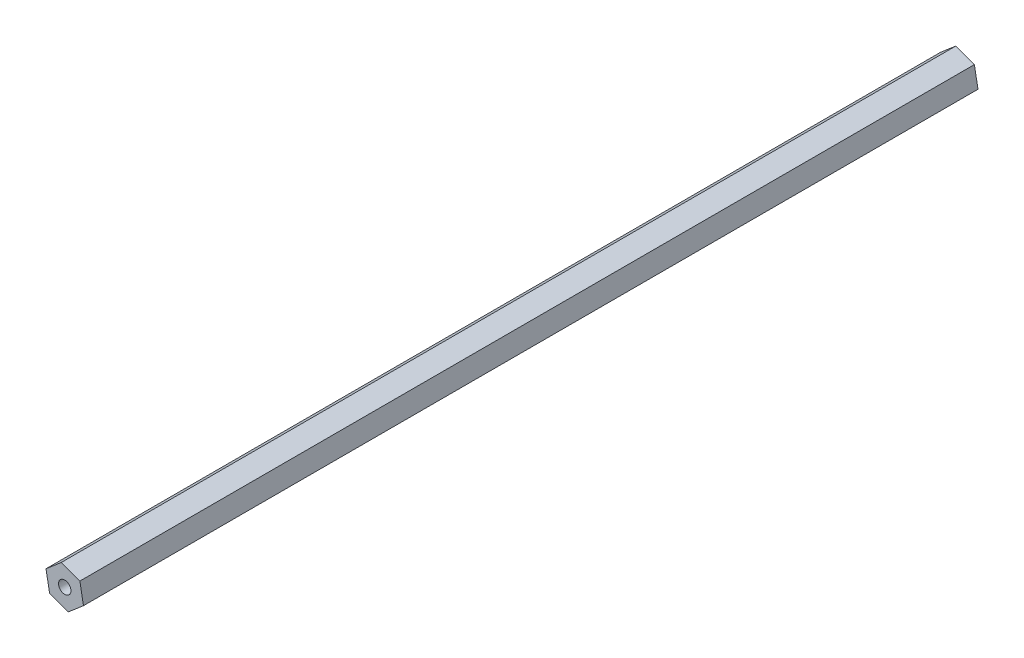
ISO-10303-21;
HEADER;
FILE_DESCRIPTION(('STEP AP214'),'2;1');
FILE_NAME('part.step','',(''),(''),'','','');
FILE_SCHEMA(('AUTOMOTIVE_DESIGN { 1 0 10303 214 1 1 1 1 }'));
ENDSEC;
DATA;
#1=APPLICATION_CONTEXT('core data for automotive mechanical design processes');
#2=APPLICATION_PROTOCOL_DEFINITION('international standard','automotive_design',2000,#1);
#3=PRODUCT_CONTEXT('',#1,'mechanical');
#4=PRODUCT('Part','Part','',(#3));
#5=PRODUCT_RELATED_PRODUCT_CATEGORY('part','',(#4));
#6=PRODUCT_DEFINITION_FORMATION('','',#4);
#7=PRODUCT_DEFINITION_CONTEXT('part definition',#1,'design');
#8=PRODUCT_DEFINITION('design','',#6,#7);
#9=PRODUCT_DEFINITION_SHAPE('','',#8);
#10=(LENGTH_UNIT() NAMED_UNIT(*) SI_UNIT(.MILLI.,.METRE.));
#11=(NAMED_UNIT(*) PLANE_ANGLE_UNIT() SI_UNIT($,.RADIAN.));
#12=(NAMED_UNIT(*) SI_UNIT($,.STERADIAN.) SOLID_ANGLE_UNIT());
#13=UNCERTAINTY_MEASURE_WITH_UNIT(LENGTH_MEASURE(1.E-05),#10,'distance_accuracy_value','');
#14=(GEOMETRIC_REPRESENTATION_CONTEXT(3) GLOBAL_UNCERTAINTY_ASSIGNED_CONTEXT((#13)) GLOBAL_UNIT_ASSIGNED_CONTEXT((#10,
#11,#12)) REPRESENTATION_CONTEXT('',''));
#15=CARTESIAN_POINT('',(0.,0.,0.));
#16=DIRECTION('',(0.,0.,1.));
#17=DIRECTION('',(1.,0.,0.));
#18=AXIS2_PLACEMENT_3D('',#15,#16,#17);
#19=CARTESIAN_POINT('',(0.729309367425421,-3.93295154388985,180.));
#20=DIRECTION('',(-0.649519052838325,0.760345316287281,0.));
#21=DIRECTION('',(-0.760345316287281,-0.649519052838325,0.));
#22=AXIS2_PLACEMENT_3D('',#19,#20,#21);
#23=PLANE('',#22);
#24=DIRECTION('',(0.760345316287281,0.649519052838325,0.));
#25=VECTOR('',#24,1.);
#26=CARTESIAN_POINT('',(0.729309367425421,-3.93295154388985,0.));
#27=LINE('',#26,#25);
#28=CARTESIAN_POINT('',(0.729309367425421,-3.93295154388985,0.));
#29=VERTEX_POINT('',#28);
#30=CARTESIAN_POINT('',(3.77069063257454,-1.33487533253655,0.));
#31=VERTEX_POINT('',#30);
#32=EDGE_CURVE('E116',#29,#31,#27,.T.);
#33=ORIENTED_EDGE('',*,*,#32,.T.);
#34=DIRECTION('',(0.,0.,-1.));
#35=VECTOR('',#34,1.);
#36=CARTESIAN_POINT('',(3.77069063257454,-1.33487533253655,180.));
#37=LINE('',#36,#35);
#38=CARTESIAN_POINT('',(3.77069063257454,-1.33487533253655,180.));
#39=VERTEX_POINT('',#38);
#40=EDGE_CURVE('E11',#39,#31,#37,.T.);
#41=ORIENTED_EDGE('',*,*,#40,.F.);
#42=DIRECTION('',(0.760345316287281,0.649519052838325,0.));
#43=VECTOR('',#42,1.);
#44=CARTESIAN_POINT('',(0.729309367425421,-3.93295154388985,180.));
#45=LINE('',#44,#43);
#46=CARTESIAN_POINT('',(0.729309367425421,-3.93295154388985,180.));
#47=VERTEX_POINT('',#46);
#48=EDGE_CURVE('E127',#47,#39,#45,.T.);
#49=ORIENTED_EDGE('',*,*,#48,.F.);
#50=DIRECTION('',(0.,0.,-1.));
#51=VECTOR('',#50,1.);
#52=CARTESIAN_POINT('',(0.729309367425421,-3.93295154388985,180.));
#53=LINE('',#52,#51);
#54=EDGE_CURVE('E112',#47,#29,#53,.T.);
#55=ORIENTED_EDGE('',*,*,#54,.T.);
#56=EDGE_LOOP('',(#33,#41,#49,#55));
#57=FACE_BOUND('',#56,.T.);
#58=ADVANCED_FACE('F32',(#57),#23,.F.);
#59=CARTESIAN_POINT('',(3.77069063257454,-1.33487533253655,180.));
#60=DIRECTION('',(-0.983237885972462,-0.182327341856355,0.));
#61=DIRECTION('',(0.182327341856355,-0.983237885972462,0.));
#62=AXIS2_PLACEMENT_3D('',#59,#60,#61);
#63=PLANE('',#62);
#64=DIRECTION('',(-0.182327341856355,0.983237885972462,0.));
#65=VECTOR('',#64,1.);
#66=CARTESIAN_POINT('',(3.77069063257454,-1.33487533253655,0.));
#67=LINE('',#66,#65);
#68=CARTESIAN_POINT('',(3.04138126514912,2.5980762113533,0.));
#69=VERTEX_POINT('',#68);
#70=EDGE_CURVE('E119',#31,#69,#67,.T.);
#71=ORIENTED_EDGE('',*,*,#70,.T.);
#72=DIRECTION('',(0.,0.,-1.));
#73=VECTOR('',#72,1.);
#74=CARTESIAN_POINT('',(3.04138126514912,2.5980762113533,180.));
#75=LINE('',#74,#73);
#76=CARTESIAN_POINT('',(3.04138126514912,2.5980762113533,180.));
#77=VERTEX_POINT('',#76);
#78=EDGE_CURVE('E40',#77,#69,#75,.T.);
#79=ORIENTED_EDGE('',*,*,#78,.F.);
#80=DIRECTION('',(-0.182327341856355,0.983237885972462,0.));
#81=VECTOR('',#80,1.);
#82=CARTESIAN_POINT('',(3.77069063257454,-1.33487533253655,180.));
#83=LINE('',#82,#81);
#84=EDGE_CURVE('E85',#39,#77,#83,.T.);
#85=ORIENTED_EDGE('',*,*,#84,.F.);
#86=ORIENTED_EDGE('',*,*,#40,.T.);
#87=EDGE_LOOP('',(#71,#79,#85,#86));
#88=FACE_BOUND('',#87,.T.);
#89=ADVANCED_FACE('F152',(#88),#63,.F.);
#90=CARTESIAN_POINT('',(3.04138126514912,2.5980762113533,180.));
#91=DIRECTION('',(-0.333718833134137,-0.942672658143637,0.));
#92=DIRECTION('',(0.942672658143637,-0.333718833134137,0.));
#93=AXIS2_PLACEMENT_3D('',#90,#91,#92);
#94=PLANE('',#93);
#95=DIRECTION('',(-0.942672658143637,0.333718833134137,0.));
#96=VECTOR('',#95,1.);
#97=CARTESIAN_POINT('',(3.04138126514912,2.5980762113533,0.));
#98=LINE('',#97,#96);
#99=CARTESIAN_POINT('',(-0.729309367425422,3.93295154388985,0.));
#100=VERTEX_POINT('',#99);
#101=EDGE_CURVE('E122',#69,#100,#98,.T.);
#102=ORIENTED_EDGE('',*,*,#101,.T.);
#103=DIRECTION('',(0.,0.,-1.));
#104=VECTOR('',#103,1.);
#105=CARTESIAN_POINT('',(-0.729309367425422,3.93295154388985,180.));
#106=LINE('',#105,#104);
#107=CARTESIAN_POINT('',(-0.729309367425422,3.93295154388985,180.));
#108=VERTEX_POINT('',#107);
#109=EDGE_CURVE('E107',#108,#100,#106,.T.);
#110=ORIENTED_EDGE('',*,*,#109,.F.);
#111=DIRECTION('',(-0.942672658143637,0.333718833134137,0.));
#112=VECTOR('',#111,1.);
#113=CARTESIAN_POINT('',(3.04138126514912,2.5980762113533,180.));
#114=LINE('',#113,#112);
#115=EDGE_CURVE('E98',#77,#108,#114,.T.);
#116=ORIENTED_EDGE('',*,*,#115,.F.);
#117=ORIENTED_EDGE('',*,*,#78,.T.);
#118=EDGE_LOOP('',(#102,#110,#116,#117));
#119=FACE_BOUND('',#118,.T.);
#120=ADVANCED_FACE('F133',(#119),#94,.F.);
#121=CARTESIAN_POINT('',(-0.729309367425422,3.93295154388985,180.));
#122=DIRECTION('',(0.649519052838325,-0.760345316287281,0.));
#123=DIRECTION('',(0.760345316287281,0.649519052838325,0.));
#124=AXIS2_PLACEMENT_3D('',#121,#122,#123);
#125=PLANE('',#124);
#126=DIRECTION('',(-0.760345316287281,-0.649519052838325,0.));
#127=VECTOR('',#126,1.);
#128=CARTESIAN_POINT('',(-0.729309367425422,3.93295154388985,0.));
#129=LINE('',#128,#127);
#130=CARTESIAN_POINT('',(-3.77069063257455,1.33487533253655,0.));
#131=VERTEX_POINT('',#130);
#132=EDGE_CURVE('E106',#100,#131,#129,.T.);
#133=ORIENTED_EDGE('',*,*,#132,.T.);
#134=DIRECTION('',(0.,0.,-1.));
#135=VECTOR('',#134,1.);
#136=CARTESIAN_POINT('',(-3.77069063257455,1.33487533253655,180.));
#137=LINE('',#136,#135);
#138=CARTESIAN_POINT('',(-3.77069063257455,1.33487533253655,180.));
#139=VERTEX_POINT('',#138);
#140=EDGE_CURVE('E103',#139,#131,#137,.T.);
#141=ORIENTED_EDGE('',*,*,#140,.F.);
#142=DIRECTION('',(-0.760345316287281,-0.649519052838325,0.));
#143=VECTOR('',#142,1.);
#144=CARTESIAN_POINT('',(-0.729309367425422,3.93295154388985,180.));
#145=LINE('',#144,#143);
#146=EDGE_CURVE('E92',#108,#139,#145,.T.);
#147=ORIENTED_EDGE('',*,*,#146,.F.);
#148=ORIENTED_EDGE('',*,*,#109,.T.);
#149=EDGE_LOOP('',(#133,#141,#147,#148));
#150=FACE_BOUND('',#149,.T.);
#151=ADVANCED_FACE('F104',(#150),#125,.F.);
#152=CARTESIAN_POINT('',(-3.77069063257455,1.33487533253655,180.));
#153=DIRECTION('',(0.983237885972462,0.182327341856355,0.));
#154=DIRECTION('',(-0.182327341856355,0.983237885972462,0.));
#155=AXIS2_PLACEMENT_3D('',#152,#153,#154);
#156=PLANE('',#155);
#157=DIRECTION('',(0.182327341856355,-0.983237885972462,0.));
#158=VECTOR('',#157,1.);
#159=CARTESIAN_POINT('',(-3.77069063257455,1.33487533253655,0.));
#160=LINE('',#159,#158);
#161=CARTESIAN_POINT('',(-3.04138126514913,-2.5980762113533,0.));
#162=VERTEX_POINT('',#161);
#163=EDGE_CURVE('E71',#131,#162,#160,.T.);
#164=ORIENTED_EDGE('',*,*,#163,.T.);
#165=DIRECTION('',(0.,0.,-1.));
#166=VECTOR('',#165,1.);
#167=CARTESIAN_POINT('',(-3.04138126514913,-2.5980762113533,180.));
#168=LINE('',#167,#166);
#169=CARTESIAN_POINT('',(-3.04138126514913,-2.5980762113533,180.));
#170=VERTEX_POINT('',#169);
#171=EDGE_CURVE('E108',#170,#162,#168,.T.);
#172=ORIENTED_EDGE('',*,*,#171,.F.);
#173=DIRECTION('',(0.182327341856355,-0.983237885972462,0.));
#174=VECTOR('',#173,1.);
#175=CARTESIAN_POINT('',(-3.77069063257455,1.33487533253655,180.));
#176=LINE('',#175,#174);
#177=EDGE_CURVE('E96',#139,#170,#176,.T.);
#178=ORIENTED_EDGE('',*,*,#177,.F.);
#179=ORIENTED_EDGE('',*,*,#140,.T.);
#180=EDGE_LOOP('',(#164,#172,#178,#179));
#181=FACE_BOUND('',#180,.T.);
#182=ADVANCED_FACE('F110',(#181),#156,.F.);
#183=CARTESIAN_POINT('',(-3.04138126514913,-2.5980762113533,180.));
#184=DIRECTION('',(0.333718833134137,0.942672658143637,0.));
#185=DIRECTION('',(-0.942672658143637,0.333718833134137,0.));
#186=AXIS2_PLACEMENT_3D('',#183,#184,#185);
#187=PLANE('',#186);
#188=DIRECTION('',(0.942672658143637,-0.333718833134137,0.));
#189=VECTOR('',#188,1.);
#190=CARTESIAN_POINT('',(-3.04138126514913,-2.5980762113533,0.));
#191=LINE('',#190,#189);
#192=EDGE_CURVE('E77',#162,#29,#191,.T.);
#193=ORIENTED_EDGE('',*,*,#192,.T.);
#194=ORIENTED_EDGE('',*,*,#54,.F.);
#195=DIRECTION('',(0.942672658143637,-0.333718833134137,0.));
#196=VECTOR('',#195,1.);
#197=CARTESIAN_POINT('',(-3.04138126514913,-2.5980762113533,180.));
#198=LINE('',#197,#196);
#199=EDGE_CURVE('E48',#170,#47,#198,.T.);
#200=ORIENTED_EDGE('',*,*,#199,.F.);
#201=ORIENTED_EDGE('',*,*,#171,.T.);
#202=EDGE_LOOP('',(#193,#194,#200,#201));
#203=FACE_BOUND('',#202,.T.);
#204=ADVANCED_FACE('F140',(#203),#187,.F.);
#205=CARTESIAN_POINT('',(0.,0.,180.));
#206=DIRECTION('',(0.,0.,1.));
#207=DIRECTION('',(1.,0.,0.));
#208=AXIS2_PLACEMENT_3D('',#205,#206,#207);
#209=PLANE('',#208);
#210=CARTESIAN_POINT('',(0.,0.,180.));
#211=DIRECTION('',(0.,0.,-1.));
#212=DIRECTION('',(-1.,0.,0.));
#213=AXIS2_PLACEMENT_3D('',#210,#211,#212);
#214=CIRCLE('',#213,1.25);
#215=CARTESIAN_POINT('',(-1.25,0.,180.));
#216=VERTEX_POINT('',#215);
#217=EDGE_CURVE('E236',#216,#216,#214,.T.);
#218=ORIENTED_EDGE('',*,*,#217,.T.);
#219=EDGE_LOOP('',(#218));
#220=FACE_BOUND('',#219,.T.);
#221=ORIENTED_EDGE('',*,*,#48,.T.);
#222=ORIENTED_EDGE('',*,*,#84,.T.);
#223=ORIENTED_EDGE('',*,*,#115,.T.);
#224=ORIENTED_EDGE('',*,*,#146,.T.);
#225=ORIENTED_EDGE('',*,*,#177,.T.);
#226=ORIENTED_EDGE('',*,*,#199,.T.);
#227=EDGE_LOOP('',(#221,#222,#223,#224,#225,#226));
#228=FACE_BOUND('',#227,.T.);
#229=ADVANCED_FACE('F94',(#220,#228),#209,.T.);
#230=CARTESIAN_POINT('',(0.,0.,0.));
#231=DIRECTION('',(0.,0.,1.));
#232=DIRECTION('',(1.,0.,0.));
#233=AXIS2_PLACEMENT_3D('',#230,#231,#232);
#234=PLANE('',#233);
#235=CARTESIAN_POINT('',(0.,0.,0.));
#236=DIRECTION('',(0.,0.,-1.));
#237=DIRECTION('',(-1.,0.,0.));
#238=AXIS2_PLACEMENT_3D('',#235,#236,#237);
#239=CIRCLE('',#238,1.25);
#240=CARTESIAN_POINT('',(-1.25,0.,0.));
#241=VERTEX_POINT('',#240);
#242=EDGE_CURVE('E235',#241,#241,#239,.T.);
#243=ORIENTED_EDGE('',*,*,#242,.F.);
#244=EDGE_LOOP('',(#243));
#245=FACE_BOUND('',#244,.T.);
#246=ORIENTED_EDGE('',*,*,#32,.F.);
#247=ORIENTED_EDGE('',*,*,#192,.F.);
#248=ORIENTED_EDGE('',*,*,#163,.F.);
#249=ORIENTED_EDGE('',*,*,#132,.F.);
#250=ORIENTED_EDGE('',*,*,#101,.F.);
#251=ORIENTED_EDGE('',*,*,#70,.F.);
#252=EDGE_LOOP('',(#246,#247,#248,#249,#250,#251));
#253=FACE_BOUND('',#252,.T.);
#254=ADVANCED_FACE('F136',(#245,#253),#234,.F.);
#255=CARTESIAN_POINT('',(0.,0.,5.));
#256=DIRECTION('',(0.,0.,-1.));
#257=DIRECTION('',(-1.,0.,0.));
#258=AXIS2_PLACEMENT_3D('',#255,#256,#257);
#259=CYLINDRICAL_SURFACE('',#258,1.25);
#260=CARTESIAN_POINT('',(0.,0.,5.));
#261=DIRECTION('',(0.,0.,-1.));
#262=DIRECTION('',(-1.,0.,0.));
#263=AXIS2_PLACEMENT_3D('',#260,#261,#262);
#264=CIRCLE('',#263,1.25);
#265=CARTESIAN_POINT('',(-1.25,0.,5.));
#266=VERTEX_POINT('',#265);
#267=EDGE_CURVE('E120',#266,#266,#264,.T.);
#268=ORIENTED_EDGE('',*,*,#267,.F.);
#269=EDGE_LOOP('',(#268));
#270=FACE_BOUND('',#269,.T.);
#271=ORIENTED_EDGE('',*,*,#242,.T.);
#272=EDGE_LOOP('',(#271));
#273=FACE_BOUND('',#272,.T.);
#274=ADVANCED_FACE('F184',(#270,#273),#259,.F.);
#275=CARTESIAN_POINT('',(0.,0.,5.));
#276=DIRECTION('',(0.,0.,-1.));
#277=DIRECTION('',(-1.,0.,0.));
#278=AXIS2_PLACEMENT_3D('',#275,#276,#277);
#279=PLANE('',#278);
#280=ORIENTED_EDGE('',*,*,#267,.T.);
#281=EDGE_LOOP('',(#280));
#282=FACE_BOUND('',#281,.T.);
#283=ADVANCED_FACE('F193',(#282),#279,.T.);
#284=CARTESIAN_POINT('',(0.,0.,175.));
#285=DIRECTION('',(0.,0.,1.));
#286=DIRECTION('',(1.,0.,0.));
#287=AXIS2_PLACEMENT_3D('',#284,#285,#286);
#288=CYLINDRICAL_SURFACE('',#287,1.25);
#289=CARTESIAN_POINT('',(0.,0.,175.));
#290=DIRECTION('',(0.,0.,-1.));
#291=DIRECTION('',(-1.,0.,0.));
#292=AXIS2_PLACEMENT_3D('',#289,#290,#291);
#293=CIRCLE('',#292,1.25);
#294=CARTESIAN_POINT('',(-1.25,0.,175.));
#295=VERTEX_POINT('',#294);
#296=EDGE_CURVE('E234',#295,#295,#293,.T.);
#297=ORIENTED_EDGE('',*,*,#296,.T.);
#298=EDGE_LOOP('',(#297));
#299=FACE_BOUND('',#298,.T.);
#300=ORIENTED_EDGE('',*,*,#217,.F.);
#301=EDGE_LOOP('',(#300));
#302=FACE_BOUND('',#301,.T.);
#303=ADVANCED_FACE('F203',(#299,#302),#288,.F.);
#304=CARTESIAN_POINT('',(0.,0.,175.));
#305=DIRECTION('',(0.,0.,1.));
#306=DIRECTION('',(-1.,0.,0.));
#307=AXIS2_PLACEMENT_3D('',#304,#305,#306);
#308=PLANE('',#307);
#309=ORIENTED_EDGE('',*,*,#296,.F.);
#310=EDGE_LOOP('',(#309));
#311=FACE_BOUND('',#310,.T.);
#312=ADVANCED_FACE('F218',(#311),#308,.T.);
#313=CLOSED_SHELL('',(#58,#89,#120,#151,#182,#204,#229,#254,#274,#283,#303,#312));
#314=MANIFOLD_SOLID_BREP('B2',#313);
#315=ADVANCED_BREP_SHAPE_REPRESENTATION('',(#18,#314),#14);
#316=SHAPE_DEFINITION_REPRESENTATION(#9,#315);
ENDSEC;
END-ISO-10303-21;
